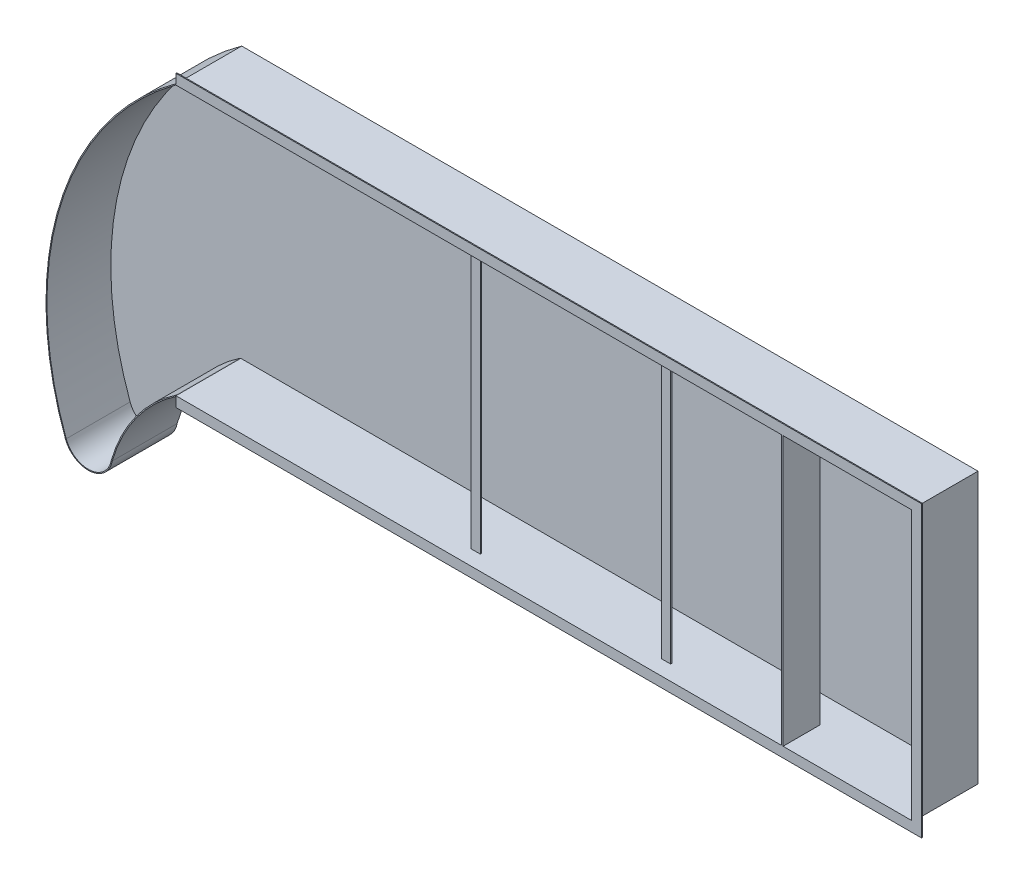
ISO-10303-21;
HEADER;
FILE_DESCRIPTION(('STEP AP214'),'2;1');
FILE_NAME('part.step','',(''),(''),'','','');
FILE_SCHEMA(('AUTOMOTIVE_DESIGN { 1 0 10303 214 1 1 1 1 }'));
ENDSEC;
DATA;
#1=APPLICATION_CONTEXT('core data for automotive mechanical design processes');
#2=APPLICATION_PROTOCOL_DEFINITION('international standard','automotive_design',2000,#1);
#3=PRODUCT_CONTEXT('',#1,'mechanical');
#4=PRODUCT('Part','Part','',(#3));
#5=PRODUCT_RELATED_PRODUCT_CATEGORY('part','',(#4));
#6=PRODUCT_DEFINITION_FORMATION('','',#4);
#7=PRODUCT_DEFINITION_CONTEXT('part definition',#1,'design');
#8=PRODUCT_DEFINITION('design','',#6,#7);
#9=PRODUCT_DEFINITION_SHAPE('','',#8);
#10=(LENGTH_UNIT() NAMED_UNIT(*) SI_UNIT(.MILLI.,.METRE.));
#11=(NAMED_UNIT(*) PLANE_ANGLE_UNIT() SI_UNIT($,.RADIAN.));
#12=(NAMED_UNIT(*) SI_UNIT($,.STERADIAN.) SOLID_ANGLE_UNIT());
#13=UNCERTAINTY_MEASURE_WITH_UNIT(LENGTH_MEASURE(1.E-05),#10,'distance_accuracy_value','');
#14=(GEOMETRIC_REPRESENTATION_CONTEXT(3) GLOBAL_UNCERTAINTY_ASSIGNED_CONTEXT((#13)) GLOBAL_UNIT_ASSIGNED_CONTEXT((#10,
#11,#12)) REPRESENTATION_CONTEXT('',''));
#15=CARTESIAN_POINT('',(0.,0.,0.));
#16=DIRECTION('',(0.,0.,1.));
#17=DIRECTION('',(1.,0.,0.));
#18=AXIS2_PLACEMENT_3D('',#15,#16,#17);
#19=CARTESIAN_POINT('',(793.,290.5,142.));
#20=DIRECTION('',(0.,1.,0.));
#21=DIRECTION('',(0.,0.,1.));
#22=AXIS2_PLACEMENT_3D('',#19,#20,#21);
#23=PLANE('',#22);
#24=DIRECTION('',(0.,0.,1.));
#25=VECTOR('',#24,1.);
#26=CARTESIAN_POINT('',(-170.065727279285,290.5,109.571414121646));
#27=LINE('',#26,#25);
#28=CARTESIAN_POINT('',(-170.065727279285,290.5,106.571414121646));
#29=VERTEX_POINT('',#28);
#30=CARTESIAN_POINT('',(-170.065727279285,290.5,109.571414121646));
#31=VERTEX_POINT('',#30);
#32=EDGE_CURVE('E314',#29,#31,#27,.T.);
#33=ORIENTED_EDGE('',*,*,#32,.F.);
#34=DIRECTION('',(1.,0.,0.));
#35=VECTOR('',#34,1.);
#36=CARTESIAN_POINT('',(-190.065727279285,290.5,106.571414121646));
#37=LINE('',#36,#35);
#38=CARTESIAN_POINT('',(-190.065727279285,290.5,106.571414121646));
#39=VERTEX_POINT('',#38);
#40=EDGE_CURVE('E301',#39,#29,#37,.T.);
#41=ORIENTED_EDGE('',*,*,#40,.F.);
#42=DIRECTION('',(0.,0.,-1.));
#43=VECTOR('',#42,1.);
#44=CARTESIAN_POINT('',(-190.065727279285,290.5,109.571414121646));
#45=LINE('',#44,#43);
#46=CARTESIAN_POINT('',(-190.065727279285,290.5,109.571414121646));
#47=VERTEX_POINT('',#46);
#48=EDGE_CURVE('E306',#47,#39,#45,.T.);
#49=ORIENTED_EDGE('',*,*,#48,.F.);
#50=DIRECTION('',(-1.,0.,0.));
#51=VECTOR('',#50,1.);
#52=CARTESIAN_POINT('',(-190.065727279285,290.5,109.571414121646));
#53=LINE('',#52,#51);
#54=EDGE_CURVE('E310',#31,#47,#53,.T.);
#55=ORIENTED_EDGE('',*,*,#54,.F.);
#56=EDGE_LOOP('',(#33,#41,#49,#55));
#57=FACE_BOUND('',#56,.T.);
#58=DIRECTION('',(1.,0.,0.));
#59=VECTOR('',#58,1.);
#60=CARTESIAN_POINT('',(793.,290.5,142.));
#61=LINE('',#60,#59);
#62=CARTESIAN_POINT('',(516.,290.5,142.));
#63=VERTEX_POINT('',#62);
#64=CARTESIAN_POINT('',(793.,290.5,142.));
#65=VERTEX_POINT('',#64);
#66=EDGE_CURVE('E442',#63,#65,#61,.T.);
#67=ORIENTED_EDGE('',*,*,#66,.F.);
#68=DIRECTION('',(0.,0.,-1.));
#69=VECTOR('',#68,1.);
#70=CARTESIAN_POINT('',(516.,290.5,142.));
#71=LINE('',#70,#69);
#72=CARTESIAN_POINT('',(516.,290.5,62.0000000000001));
#73=VERTEX_POINT('',#72);
#74=EDGE_CURVE('E61',#63,#73,#71,.T.);
#75=ORIENTED_EDGE('',*,*,#74,.T.);
#76=DIRECTION('',(-1.,0.,0.));
#77=VECTOR('',#76,1.);
#78=CARTESIAN_POINT('',(516.,290.5,62.0000000000001));
#79=LINE('',#78,#77);
#80=CARTESIAN_POINT('',(513.,290.5,62.0000000000001));
#81=VERTEX_POINT('',#80);
#82=EDGE_CURVE('E246',#73,#81,#79,.T.);
#83=ORIENTED_EDGE('',*,*,#82,.T.);
#84=DIRECTION('',(0.,0.,-1.));
#85=VECTOR('',#84,1.);
#86=CARTESIAN_POINT('',(513.,290.5,142.));
#87=LINE('',#86,#85);
#88=CARTESIAN_POINT('',(513.,290.5,142.));
#89=VERTEX_POINT('',#88);
#90=EDGE_CURVE('E265',#89,#81,#87,.T.);
#91=ORIENTED_EDGE('',*,*,#90,.F.);
#92=CARTESIAN_POINT('',(-795.,290.5,142.));
#93=VERTEX_POINT('',#92);
#94=EDGE_CURVE('E444',#93,#89,#61,.T.);
#95=ORIENTED_EDGE('',*,*,#94,.F.);
#96=DIRECTION('',(0.,0.,-1.));
#97=VECTOR('',#96,1.);
#98=CARTESIAN_POINT('',(-795.,290.5,142.));
#99=LINE('',#98,#97);
#100=CARTESIAN_POINT('',(-795.,290.5,140.));
#101=VERTEX_POINT('',#100);
#102=EDGE_CURVE('E470',#93,#101,#99,.T.);
#103=ORIENTED_EDGE('',*,*,#102,.T.);
#104=DIRECTION('',(0.,0.,-1.));
#105=VECTOR('',#104,1.);
#106=CARTESIAN_POINT('',(-795.,290.5,142.));
#107=LINE('',#106,#105);
#108=CARTESIAN_POINT('',(-795.,290.5,2.));
#109=VERTEX_POINT('',#108);
#110=EDGE_CURVE('E398',#101,#109,#107,.T.);
#111=ORIENTED_EDGE('',*,*,#110,.T.);
#112=DIRECTION('',(1.,0.,0.));
#113=VECTOR('',#112,1.);
#114=CARTESIAN_POINT('',(793.,290.5,2.));
#115=LINE('',#114,#113);
#116=CARTESIAN_POINT('',(793.,290.5,2.));
#117=VERTEX_POINT('',#116);
#118=EDGE_CURVE('E439',#109,#117,#115,.T.);
#119=ORIENTED_EDGE('',*,*,#118,.T.);
#120=DIRECTION('',(0.,0.,-1.));
#121=VECTOR('',#120,1.);
#122=CARTESIAN_POINT('',(793.,290.5,142.));
#123=LINE('',#122,#121);
#124=EDGE_CURVE('E467',#65,#117,#123,.T.);
#125=ORIENTED_EDGE('',*,*,#124,.F.);
#126=EDGE_LOOP('',(#67,#75,#83,#91,#95,#103,#111,#119,#125));
#127=FACE_BOUND('',#126,.T.);
#128=DIRECTION('',(0.,0.,1.));
#129=VECTOR('',#128,1.);
#130=CARTESIAN_POINT('',(240.676945023838,290.5,109.571414121646));
#131=LINE('',#130,#129);
#132=CARTESIAN_POINT('',(240.676945023838,290.5,106.571414121646));
#133=VERTEX_POINT('',#132);
#134=CARTESIAN_POINT('',(240.676945023838,290.5,109.571414121646));
#135=VERTEX_POINT('',#134);
#136=EDGE_CURVE('E282',#133,#135,#131,.T.);
#137=ORIENTED_EDGE('',*,*,#136,.F.);
#138=DIRECTION('',(1.,0.,0.));
#139=VECTOR('',#138,1.);
#140=CARTESIAN_POINT('',(220.676945023838,290.5,106.571414121646));
#141=LINE('',#140,#139);
#142=CARTESIAN_POINT('',(220.676945023838,290.5,106.571414121646));
#143=VERTEX_POINT('',#142);
#144=EDGE_CURVE('E269',#143,#133,#141,.T.);
#145=ORIENTED_EDGE('',*,*,#144,.F.);
#146=DIRECTION('',(0.,0.,-1.));
#147=VECTOR('',#146,1.);
#148=CARTESIAN_POINT('',(220.676945023838,290.5,109.571414121646));
#149=LINE('',#148,#147);
#150=CARTESIAN_POINT('',(220.676945023838,290.5,109.571414121646));
#151=VERTEX_POINT('',#150);
#152=EDGE_CURVE('E274',#151,#143,#149,.T.);
#153=ORIENTED_EDGE('',*,*,#152,.F.);
#154=DIRECTION('',(-1.,0.,0.));
#155=VECTOR('',#154,1.);
#156=CARTESIAN_POINT('',(220.676945023838,290.5,109.571414121646));
#157=LINE('',#156,#155);
#158=EDGE_CURVE('E278',#135,#151,#157,.T.);
#159=ORIENTED_EDGE('',*,*,#158,.F.);
#160=EDGE_LOOP('',(#137,#145,#153,#159));
#161=FACE_BOUND('',#160,.T.);
#162=ADVANCED_FACE('F37',(#57,#127,#161),#23,.F.);
#163=CARTESIAN_POINT('',(-795.,-290.5,142.));
#164=DIRECTION('',(0.,-1.,0.));
#165=DIRECTION('',(0.,0.,-1.));
#166=AXIS2_PLACEMENT_3D('',#163,#164,#165);
#167=PLANE('',#166);
#168=DIRECTION('',(0.,0.,1.));
#169=VECTOR('',#168,1.);
#170=CARTESIAN_POINT('',(-170.065727279285,-290.5,109.571414121646));
#171=LINE('',#170,#169);
#172=CARTESIAN_POINT('',(-170.065727279285,-290.5,106.571414121646));
#173=VERTEX_POINT('',#172);
#174=CARTESIAN_POINT('',(-170.065727279285,-290.5,109.571414121646));
#175=VERTEX_POINT('',#174);
#176=EDGE_CURVE('E322',#173,#175,#171,.T.);
#177=ORIENTED_EDGE('',*,*,#176,.T.);
#178=DIRECTION('',(-1.,0.,0.));
#179=VECTOR('',#178,1.);
#180=CARTESIAN_POINT('',(-190.065727279285,-290.5,109.571414121646));
#181=LINE('',#180,#179);
#182=CARTESIAN_POINT('',(-190.065727279285,-290.5,109.571414121646));
#183=VERTEX_POINT('',#182);
#184=EDGE_CURVE('E320',#175,#183,#181,.T.);
#185=ORIENTED_EDGE('',*,*,#184,.T.);
#186=DIRECTION('',(0.,0.,-1.));
#187=VECTOR('',#186,1.);
#188=CARTESIAN_POINT('',(-190.065727279285,-290.5,109.571414121646));
#189=LINE('',#188,#187);
#190=CARTESIAN_POINT('',(-190.065727279285,-290.5,106.571414121646));
#191=VERTEX_POINT('',#190);
#192=EDGE_CURVE('E317',#183,#191,#189,.T.);
#193=ORIENTED_EDGE('',*,*,#192,.T.);
#194=DIRECTION('',(1.,0.,0.));
#195=VECTOR('',#194,1.);
#196=CARTESIAN_POINT('',(-190.065727279285,-290.5,106.571414121646));
#197=LINE('',#196,#195);
#198=EDGE_CURVE('E304',#191,#173,#197,.T.);
#199=ORIENTED_EDGE('',*,*,#198,.T.);
#200=EDGE_LOOP('',(#177,#185,#193,#199));
#201=FACE_BOUND('',#200,.T.);
#202=DIRECTION('',(-1.,0.,0.));
#203=VECTOR('',#202,1.);
#204=CARTESIAN_POINT('',(516.,-290.5,62.0000000000001));
#205=LINE('',#204,#203);
#206=CARTESIAN_POINT('',(516.,-290.5,62.0000000000001));
#207=VERTEX_POINT('',#206);
#208=CARTESIAN_POINT('',(513.,-290.5,62.0000000000001));
#209=VERTEX_POINT('',#208);
#210=EDGE_CURVE('E244',#207,#209,#205,.T.);
#211=ORIENTED_EDGE('',*,*,#210,.F.);
#212=DIRECTION('',(0.,0.,-1.));
#213=VECTOR('',#212,1.);
#214=CARTESIAN_POINT('',(516.,-290.5,142.));
#215=LINE('',#214,#213);
#216=CARTESIAN_POINT('',(516.,-290.5,142.));
#217=VERTEX_POINT('',#216);
#218=EDGE_CURVE('E247',#217,#207,#215,.T.);
#219=ORIENTED_EDGE('',*,*,#218,.F.);
#220=DIRECTION('',(-1.,0.,0.));
#221=VECTOR('',#220,1.);
#222=CARTESIAN_POINT('',(-795.,-290.5,142.));
#223=LINE('',#222,#221);
#224=CARTESIAN_POINT('',(793.,-290.5,142.));
#225=VERTEX_POINT('',#224);
#226=EDGE_CURVE('E450',#225,#217,#223,.T.);
#227=ORIENTED_EDGE('',*,*,#226,.F.);
#228=DIRECTION('',(0.,0.,-1.));
#229=VECTOR('',#228,1.);
#230=CARTESIAN_POINT('',(793.,-290.5,142.));
#231=LINE('',#230,#229);
#232=CARTESIAN_POINT('',(793.,-290.5,2.));
#233=VERTEX_POINT('',#232);
#234=EDGE_CURVE('E464',#225,#233,#231,.T.);
#235=ORIENTED_EDGE('',*,*,#234,.T.);
#236=DIRECTION('',(-1.,0.,0.));
#237=VECTOR('',#236,1.);
#238=CARTESIAN_POINT('',(-795.,-290.5,2.));
#239=LINE('',#238,#237);
#240=CARTESIAN_POINT('',(-795.,-290.5,2.));
#241=VERTEX_POINT('',#240);
#242=EDGE_CURVE('E443',#233,#241,#239,.T.);
#243=ORIENTED_EDGE('',*,*,#242,.T.);
#244=DIRECTION('',(0.,0.,1.));
#245=VECTOR('',#244,1.);
#246=CARTESIAN_POINT('',(-795.,-290.5,142.));
#247=LINE('',#246,#245);
#248=CARTESIAN_POINT('',(-795.,-290.5,140.));
#249=VERTEX_POINT('',#248);
#250=EDGE_CURVE('E394',#241,#249,#247,.T.);
#251=ORIENTED_EDGE('',*,*,#250,.T.);
#252=DIRECTION('',(0.,0.,-1.));
#253=VECTOR('',#252,1.);
#254=CARTESIAN_POINT('',(-795.,-290.5,142.));
#255=LINE('',#254,#253);
#256=CARTESIAN_POINT('',(-795.,-290.5,142.));
#257=VERTEX_POINT('',#256);
#258=EDGE_CURVE('E454',#257,#249,#255,.T.);
#259=ORIENTED_EDGE('',*,*,#258,.F.);
#260=CARTESIAN_POINT('',(513.,-290.5,142.));
#261=VERTEX_POINT('',#260);
#262=EDGE_CURVE('E449',#261,#257,#223,.T.);
#263=ORIENTED_EDGE('',*,*,#262,.F.);
#264=DIRECTION('',(0.,0.,-1.));
#265=VECTOR('',#264,1.);
#266=CARTESIAN_POINT('',(513.,-290.5,142.));
#267=LINE('',#266,#265);
#268=EDGE_CURVE('E53',#261,#209,#267,.T.);
#269=ORIENTED_EDGE('',*,*,#268,.T.);
#270=EDGE_LOOP('',(#211,#219,#227,#235,#243,#251,#259,#263,#269));
#271=FACE_BOUND('',#270,.T.);
#272=DIRECTION('',(0.,0.,1.));
#273=VECTOR('',#272,1.);
#274=CARTESIAN_POINT('',(240.676945023838,-290.5,109.571414121646));
#275=LINE('',#274,#273);
#276=CARTESIAN_POINT('',(240.676945023838,-290.5,106.571414121646));
#277=VERTEX_POINT('',#276);
#278=CARTESIAN_POINT('',(240.676945023838,-290.5,109.571414121646));
#279=VERTEX_POINT('',#278);
#280=EDGE_CURVE('E290',#277,#279,#275,.T.);
#281=ORIENTED_EDGE('',*,*,#280,.T.);
#282=DIRECTION('',(-1.,0.,0.));
#283=VECTOR('',#282,1.);
#284=CARTESIAN_POINT('',(220.676945023838,-290.5,109.571414121646));
#285=LINE('',#284,#283);
#286=CARTESIAN_POINT('',(220.676945023838,-290.5,109.571414121646));
#287=VERTEX_POINT('',#286);
#288=EDGE_CURVE('E288',#279,#287,#285,.T.);
#289=ORIENTED_EDGE('',*,*,#288,.T.);
#290=DIRECTION('',(0.,0.,-1.));
#291=VECTOR('',#290,1.);
#292=CARTESIAN_POINT('',(220.676945023838,-290.5,109.571414121646));
#293=LINE('',#292,#291);
#294=CARTESIAN_POINT('',(220.676945023838,-290.5,106.571414121646));
#295=VERTEX_POINT('',#294);
#296=EDGE_CURVE('E285',#287,#295,#293,.T.);
#297=ORIENTED_EDGE('',*,*,#296,.T.);
#298=DIRECTION('',(1.,0.,0.));
#299=VECTOR('',#298,1.);
#300=CARTESIAN_POINT('',(220.676945023838,-290.5,106.571414121646));
#301=LINE('',#300,#299);
#302=EDGE_CURVE('E272',#295,#277,#301,.T.);
#303=ORIENTED_EDGE('',*,*,#302,.T.);
#304=EDGE_LOOP('',(#281,#289,#297,#303));
#305=FACE_BOUND('',#304,.T.);
#306=ADVANCED_FACE('F256',(#201,#271,#305),#167,.F.);
#307=CARTESIAN_POINT('',(-795.,-292.5,2.));
#308=DIRECTION('',(1.,0.,0.));
#309=DIRECTION('',(0.,0.,-1.));
#310=AXIS2_PLACEMENT_3D('',#307,#308,#309);
#311=PLANE('',#310);
#312=DIRECTION('',(0.,-1.,0.));
#313=VECTOR('',#312,1.);
#314=CARTESIAN_POINT('',(-795.,292.5,140.));
#315=LINE('',#314,#313);
#316=CARTESIAN_POINT('',(-795.,-292.5,140.));
#317=VERTEX_POINT('',#316);
#318=EDGE_CURVE('E377',#249,#317,#315,.T.);
#319=ORIENTED_EDGE('',*,*,#318,.T.);
#320=DIRECTION('',(0.,1.,0.));
#321=VECTOR('',#320,1.);
#322=CARTESIAN_POINT('',(-795.,-312.5,140.));
#323=LINE('',#322,#321);
#324=CARTESIAN_POINT('',(-795.,-312.5,140.));
#325=VERTEX_POINT('',#324);
#326=EDGE_CURVE('E434',#325,#317,#323,.T.);
#327=ORIENTED_EDGE('',*,*,#326,.F.);
#328=DIRECTION('',(0.,0.,-1.));
#329=VECTOR('',#328,1.);
#330=CARTESIAN_POINT('',(-795.,-312.5,142.));
#331=LINE('',#330,#329);
#332=CARTESIAN_POINT('',(-795.,-312.5,142.));
#333=VERTEX_POINT('',#332);
#334=EDGE_CURVE('E430',#333,#325,#331,.T.);
#335=ORIENTED_EDGE('',*,*,#334,.F.);
#336=DIRECTION('',(0.,-1.,0.));
#337=VECTOR('',#336,1.);
#338=CARTESIAN_POINT('',(-795.,-290.5,142.));
#339=LINE('',#338,#337);
#340=EDGE_CURVE('E452',#257,#333,#339,.T.);
#341=ORIENTED_EDGE('',*,*,#340,.F.);
#342=ORIENTED_EDGE('',*,*,#258,.T.);
#343=EDGE_LOOP('',(#319,#327,#335,#341,#342));
#344=FACE_BOUND('',#343,.T.);
#345=ADVANCED_FACE('F532',(#344),#311,.F.);
#346=CARTESIAN_POINT('',(-795.,292.5,140.));
#347=VERTEX_POINT('',#346);
#348=EDGE_CURVE('E378',#347,#101,#315,.T.);
#349=ORIENTED_EDGE('',*,*,#348,.T.);
#350=ORIENTED_EDGE('',*,*,#102,.F.);
#351=DIRECTION('',(0.,-1.,0.));
#352=VECTOR('',#351,1.);
#353=CARTESIAN_POINT('',(-795.,292.5,142.));
#354=LINE('',#353,#352);
#355=CARTESIAN_POINT('',(-795.,312.5,142.));
#356=VERTEX_POINT('',#355);
#357=EDGE_CURVE('E440',#356,#93,#354,.T.);
#358=ORIENTED_EDGE('',*,*,#357,.F.);
#359=DIRECTION('',(0.,0.,-1.));
#360=VECTOR('',#359,1.);
#361=CARTESIAN_POINT('',(-795.,312.5,142.));
#362=LINE('',#361,#360);
#363=CARTESIAN_POINT('',(-795.,312.5,140.));
#364=VERTEX_POINT('',#363);
#365=EDGE_CURVE('E419',#356,#364,#362,.T.);
#366=ORIENTED_EDGE('',*,*,#365,.T.);
#367=DIRECTION('',(0.,-1.,0.));
#368=VECTOR('',#367,1.);
#369=CARTESIAN_POINT('',(-795.,312.5,140.));
#370=LINE('',#369,#368);
#371=EDGE_CURVE('E422',#364,#347,#370,.T.);
#372=ORIENTED_EDGE('',*,*,#371,.T.);
#373=EDGE_LOOP('',(#349,#350,#358,#366,#372));
#374=FACE_BOUND('',#373,.T.);
#375=ADVANCED_FACE('F548',(#374),#311,.F.);
#376=CARTESIAN_POINT('',(795.,-292.5,2.));
#377=DIRECTION('',(-1.,0.,0.));
#378=DIRECTION('',(0.,0.,1.));
#379=AXIS2_PLACEMENT_3D('',#376,#377,#378);
#380=PLANE('',#379);
#381=DIRECTION('',(0.,1.,0.));
#382=VECTOR('',#381,1.);
#383=CARTESIAN_POINT('',(795.,292.5,140.));
#384=LINE('',#383,#382);
#385=CARTESIAN_POINT('',(795.,-292.5,140.));
#386=VERTEX_POINT('',#385);
#387=CARTESIAN_POINT('',(795.,292.5,140.));
#388=VERTEX_POINT('',#387);
#389=EDGE_CURVE('E11',#386,#388,#384,.T.);
#390=ORIENTED_EDGE('',*,*,#389,.F.);
#391=DIRECTION('',(0.,0.,-1.));
#392=VECTOR('',#391,1.);
#393=CARTESIAN_POINT('',(795.,-292.5,2.));
#394=LINE('',#393,#392);
#395=CARTESIAN_POINT('',(795.,-292.5,0.));
#396=VERTEX_POINT('',#395);
#397=EDGE_CURVE('E481',#386,#396,#394,.T.);
#398=ORIENTED_EDGE('',*,*,#397,.T.);
#399=DIRECTION('',(0.,1.,0.));
#400=VECTOR('',#399,1.);
#401=CARTESIAN_POINT('',(795.,-292.5,0.));
#402=LINE('',#401,#400);
#403=CARTESIAN_POINT('',(795.,292.5,0.));
#404=VERTEX_POINT('',#403);
#405=EDGE_CURVE('E473',#396,#404,#402,.T.);
#406=ORIENTED_EDGE('',*,*,#405,.T.);
#407=DIRECTION('',(0.,0.,-1.));
#408=VECTOR('',#407,1.);
#409=CARTESIAN_POINT('',(795.,292.5,2.));
#410=LINE('',#409,#408);
#411=EDGE_CURVE('E41',#388,#404,#410,.T.);
#412=ORIENTED_EDGE('',*,*,#411,.F.);
#413=EDGE_LOOP('',(#390,#398,#406,#412));
#414=FACE_BOUND('',#413,.T.);
#415=ADVANCED_FACE('F39',(#414),#380,.F.);
#416=CARTESIAN_POINT('',(-795.,-292.5,2.));
#417=DIRECTION('',(0.,1.,0.));
#418=DIRECTION('',(0.,0.,1.));
#419=AXIS2_PLACEMENT_3D('',#416,#417,#418);
#420=PLANE('',#419);
#421=DIRECTION('',(1.,0.,0.));
#422=VECTOR('',#421,1.);
#423=CARTESIAN_POINT('',(-795.,-292.5,140.));
#424=LINE('',#423,#422);
#425=EDGE_CURVE('E426',#317,#386,#424,.T.);
#426=ORIENTED_EDGE('',*,*,#425,.F.);
#427=DIRECTION('',(0.,0.,-1.));
#428=VECTOR('',#427,1.);
#429=CARTESIAN_POINT('',(-795.,-292.5,2.));
#430=LINE('',#429,#428);
#431=CARTESIAN_POINT('',(-795.,-292.5,0.));
#432=VERTEX_POINT('',#431);
#433=EDGE_CURVE('E483',#317,#432,#430,.T.);
#434=ORIENTED_EDGE('',*,*,#433,.T.);
#435=DIRECTION('',(1.,0.,0.));
#436=VECTOR('',#435,1.);
#437=CARTESIAN_POINT('',(-795.,-292.5,0.));
#438=LINE('',#437,#436);
#439=EDGE_CURVE('E478',#432,#396,#438,.T.);
#440=ORIENTED_EDGE('',*,*,#439,.T.);
#441=ORIENTED_EDGE('',*,*,#397,.F.);
#442=EDGE_LOOP('',(#426,#434,#440,#441));
#443=FACE_BOUND('',#442,.T.);
#444=ADVANCED_FACE('F502',(#443),#420,.F.);
#445=CARTESIAN_POINT('',(0.,0.,2.));
#446=DIRECTION('',(0.,0.,-1.));
#447=DIRECTION('',(-1.,0.,0.));
#448=AXIS2_PLACEMENT_3D('',#445,#446,#447);
#449=PLANE('',#448);
#450=ORIENTED_EDGE('',*,*,#242,.F.);
#451=DIRECTION('',(0.,-1.,0.));
#452=VECTOR('',#451,1.);
#453=CARTESIAN_POINT('',(793.,-290.5,2.));
#454=LINE('',#453,#452);
#455=EDGE_CURVE('E457',#117,#233,#454,.T.);
#456=ORIENTED_EDGE('',*,*,#455,.F.);
#457=ORIENTED_EDGE('',*,*,#118,.F.);
#458=DIRECTION('',(-0.723379264964384,-0.69045089544412,0.));
#459=VECTOR('',#458,1.);
#460=CARTESIAN_POINT('',(-524.086847710899,549.081131150903,2.));
#461=LINE('',#460,#459);
#462=CARTESIAN_POINT('',(-797.,288.591040401944,2.));
#463=VERTEX_POINT('',#462);
#464=EDGE_CURVE('E338',#109,#463,#461,.T.);
#465=ORIENTED_EDGE('',*,*,#464,.T.);
#466=CARTESIAN_POINT('',(-400.354894352362,-257.884436586143,2.));
#467=DIRECTION('',(0.,0.,1.));
#468=DIRECTION('',(1.,0.,0.));
#469=AXIS2_PLACEMENT_3D('',#466,#467,#468);
#470=CIRCLE('',#469,675.250166074458);
#471=CARTESIAN_POINT('',(-1033.91490125045,-491.474899668173,2.));
#472=VERTEX_POINT('',#471);
#473=EDGE_CURVE('E341',#463,#472,#470,.T.);
#474=ORIENTED_EDGE('',*,*,#473,.T.);
#475=CARTESIAN_POINT('',(-986.369111639837,-473.945000539723,2.));
#476=DIRECTION('',(0.,0.,1.));
#477=DIRECTION('',(1.,0.,0.));
#478=AXIS2_PLACEMENT_3D('',#475,#476,#477);
#479=CIRCLE('',#478,50.6744459580012);
#480=CARTESIAN_POINT('',(-936.512623715159,-483.013081095541,2.));
#481=VERTEX_POINT('',#480);
#482=EDGE_CURVE('E344',#472,#481,#479,.T.);
#483=ORIENTED_EDGE('',*,*,#482,.T.);
#484=CARTESIAN_POINT('',(-604.843589110414,-577.950649610838,2.));
#485=DIRECTION('',(0.,0.,1.));
#486=DIRECTION('',(1.,0.,0.));
#487=AXIS2_PLACEMENT_3D('',#484,#485,#486);
#488=CIRCLE('',#487,344.989116395343);
#489=CARTESIAN_POINT('',(-797.,-291.431183980189,2.));
#490=VERTEX_POINT('',#489);
#491=EDGE_CURVE('E333',#490,#481,#488,.T.);
#492=ORIENTED_EDGE('',*,*,#491,.F.);
#493=DIRECTION('',(-0.906556132597208,-0.422085273908477,0.));
#494=VECTOR('',#493,1.);
#495=CARTESIAN_POINT('',(-30.4759227444896,65.4562866046979,2.));
#496=LINE('',#495,#494);
#497=EDGE_CURVE('E335',#241,#490,#496,.T.);
#498=ORIENTED_EDGE('',*,*,#497,.F.);
#499=EDGE_LOOP('',(#450,#456,#457,#465,#474,#483,#492,#498));
#500=FACE_BOUND('',#499,.T.);
#501=ADVANCED_FACE('F539',(#500),#449,.F.);
#502=CARTESIAN_POINT('',(-795.,292.5,2.));
#503=DIRECTION('',(0.,-1.,0.));
#504=DIRECTION('',(0.,0.,-1.));
#505=AXIS2_PLACEMENT_3D('',#502,#503,#504);
#506=PLANE('',#505);
#507=DIRECTION('',(0.,0.,-1.));
#508=VECTOR('',#507,1.);
#509=CARTESIAN_POINT('',(-795.,292.5,2.));
#510=LINE('',#509,#508);
#511=CARTESIAN_POINT('',(-795.,292.5,0.));
#512=VERTEX_POINT('',#511);
#513=EDGE_CURVE('E484',#347,#512,#510,.T.);
#514=ORIENTED_EDGE('',*,*,#513,.F.);
#515=DIRECTION('',(1.,0.,0.));
#516=VECTOR('',#515,1.);
#517=CARTESIAN_POINT('',(-795.,292.5,140.));
#518=LINE('',#517,#516);
#519=EDGE_CURVE('E412',#347,#388,#518,.T.);
#520=ORIENTED_EDGE('',*,*,#519,.T.);
#521=ORIENTED_EDGE('',*,*,#411,.T.);
#522=DIRECTION('',(-1.,0.,0.));
#523=VECTOR('',#522,1.);
#524=CARTESIAN_POINT('',(-795.,292.5,0.));
#525=LINE('',#524,#523);
#526=EDGE_CURVE('E476',#404,#512,#525,.T.);
#527=ORIENTED_EDGE('',*,*,#526,.T.);
#528=EDGE_LOOP('',(#514,#520,#521,#527));
#529=FACE_BOUND('',#528,.T.);
#530=ADVANCED_FACE('F492',(#529),#506,.F.);
#531=CARTESIAN_POINT('',(0.,0.,0.));
#532=DIRECTION('',(0.,0.,-1.));
#533=DIRECTION('',(-1.,0.,0.));
#534=AXIS2_PLACEMENT_3D('',#531,#532,#533);
#535=PLANE('',#534);
#536=ORIENTED_EDGE('',*,*,#405,.F.);
#537=ORIENTED_EDGE('',*,*,#439,.F.);
#538=CARTESIAN_POINT('',(-604.843589110414,-577.950649610838,0.));
#539=DIRECTION('',(0.,0.,-1.));
#540=DIRECTION('',(-1.,0.,0.));
#541=AXIS2_PLACEMENT_3D('',#538,#539,#540);
#542=CIRCLE('',#541,342.989116395343);
#543=CARTESIAN_POINT('',(-934.562903860346,-483.469395139416,0.));
#544=VERTEX_POINT('',#543);
#545=EDGE_CURVE('E374',#544,#432,#542,.T.);
#546=ORIENTED_EDGE('',*,*,#545,.F.);
#547=CARTESIAN_POINT('',(-986.369111639837,-473.945000539723,0.));
#548=DIRECTION('',(0.,0.,-1.));
#549=DIRECTION('',(-1.,0.,0.));
#550=AXIS2_PLACEMENT_3D('',#547,#548,#549);
#551=CIRCLE('',#550,52.6744459580011);
#552=CARTESIAN_POINT('',(-1035.79142061684,-492.166763142832,0.));
#553=VERTEX_POINT('',#552);
#554=EDGE_CURVE('E363',#544,#553,#551,.T.);
#555=ORIENTED_EDGE('',*,*,#554,.T.);
#556=CARTESIAN_POINT('',(-400.354894352362,-257.884436586143,0.));
#557=DIRECTION('',(0.,0.,-1.));
#558=DIRECTION('',(-1.,0.,0.));
#559=AXIS2_PLACEMENT_3D('',#556,#557,#558);
#560=CIRCLE('',#559,677.250166074458);
#561=EDGE_CURVE('E387',#553,#512,#560,.T.);
#562=ORIENTED_EDGE('',*,*,#561,.T.);
#563=ORIENTED_EDGE('',*,*,#526,.F.);
#564=EDGE_LOOP('',(#536,#537,#546,#555,#562,#563));
#565=FACE_BOUND('',#564,.T.);
#566=ADVANCED_FACE('F497',(#565),#535,.T.);
#567=CARTESIAN_POINT('',(793.,-290.5,142.));
#568=DIRECTION('',(1.,0.,0.));
#569=DIRECTION('',(0.,0.,-1.));
#570=AXIS2_PLACEMENT_3D('',#567,#568,#569);
#571=PLANE('',#570);
#572=ORIENTED_EDGE('',*,*,#455,.T.);
#573=ORIENTED_EDGE('',*,*,#234,.F.);
#574=DIRECTION('',(0.,-1.,0.));
#575=VECTOR('',#574,1.);
#576=CARTESIAN_POINT('',(793.,-290.5,142.));
#577=LINE('',#576,#575);
#578=EDGE_CURVE('E447',#65,#225,#577,.T.);
#579=ORIENTED_EDGE('',*,*,#578,.F.);
#580=ORIENTED_EDGE('',*,*,#124,.T.);
#581=EDGE_LOOP('',(#572,#573,#579,#580));
#582=FACE_BOUND('',#581,.T.);
#583=ADVANCED_FACE('F538',(#582),#571,.F.);
#584=CARTESIAN_POINT('',(0.,0.,142.));
#585=DIRECTION('',(0.,0.,1.));
#586=DIRECTION('',(1.,0.,0.));
#587=AXIS2_PLACEMENT_3D('',#584,#585,#586);
#588=PLANE('',#587);
#589=ORIENTED_EDGE('',*,*,#226,.T.);
#590=DIRECTION('',(0.,1.,0.));
#591=VECTOR('',#590,1.);
#592=CARTESIAN_POINT('',(516.,-370.556230238502,142.));
#593=LINE('',#592,#591);
#594=EDGE_CURVE('E251',#217,#63,#593,.T.);
#595=ORIENTED_EDGE('',*,*,#594,.T.);
#596=ORIENTED_EDGE('',*,*,#66,.T.);
#597=ORIENTED_EDGE('',*,*,#578,.T.);
#598=EDGE_LOOP('',(#589,#595,#596,#597));
#599=FACE_BOUND('',#598,.T.);
#600=ORIENTED_EDGE('',*,*,#340,.T.);
#601=DIRECTION('',(-1.,0.,0.));
#602=VECTOR('',#601,1.);
#603=CARTESIAN_POINT('',(-795.,-312.5,142.));
#604=LINE('',#603,#602);
#605=CARTESIAN_POINT('',(815.,-312.5,142.));
#606=VERTEX_POINT('',#605);
#607=EDGE_CURVE('E427',#606,#333,#604,.T.);
#608=ORIENTED_EDGE('',*,*,#607,.F.);
#609=DIRECTION('',(0.,-1.,0.));
#610=VECTOR('',#609,1.);
#611=CARTESIAN_POINT('',(815.,312.5,142.));
#612=LINE('',#611,#610);
#613=CARTESIAN_POINT('',(815.,312.5,142.));
#614=VERTEX_POINT('',#613);
#615=EDGE_CURVE('E407',#614,#606,#612,.T.);
#616=ORIENTED_EDGE('',*,*,#615,.F.);
#617=DIRECTION('',(-1.,0.,0.));
#618=VECTOR('',#617,1.);
#619=CARTESIAN_POINT('',(-795.,312.5,142.));
#620=LINE('',#619,#618);
#621=EDGE_CURVE('E414',#614,#356,#620,.T.);
#622=ORIENTED_EDGE('',*,*,#621,.T.);
#623=ORIENTED_EDGE('',*,*,#357,.T.);
#624=ORIENTED_EDGE('',*,*,#94,.T.);
#625=DIRECTION('',(0.,1.,0.));
#626=VECTOR('',#625,1.);
#627=CARTESIAN_POINT('',(513.,-370.556230238502,142.));
#628=LINE('',#627,#626);
#629=EDGE_CURVE('E261',#261,#89,#628,.T.);
#630=ORIENTED_EDGE('',*,*,#629,.F.);
#631=ORIENTED_EDGE('',*,*,#262,.T.);
#632=EDGE_LOOP('',(#600,#608,#616,#622,#623,#624,#630,#631));
#633=FACE_BOUND('',#632,.T.);
#634=ADVANCED_FACE('F567',(#599,#633),#588,.T.);
#635=CARTESIAN_POINT('',(-795.,-312.5,140.));
#636=DIRECTION('',(0.,0.,1.));
#637=DIRECTION('',(1.,0.,0.));
#638=AXIS2_PLACEMENT_3D('',#635,#636,#637);
#639=PLANE('',#638);
#640=ORIENTED_EDGE('',*,*,#425,.T.);
#641=ORIENTED_EDGE('',*,*,#389,.T.);
#642=ORIENTED_EDGE('',*,*,#519,.F.);
#643=ORIENTED_EDGE('',*,*,#371,.F.);
#644=DIRECTION('',(1.,0.,0.));
#645=VECTOR('',#644,1.);
#646=CARTESIAN_POINT('',(-795.,312.5,140.));
#647=LINE('',#646,#645);
#648=CARTESIAN_POINT('',(815.,312.5,140.));
#649=VERTEX_POINT('',#648);
#650=EDGE_CURVE('E417',#364,#649,#647,.T.);
#651=ORIENTED_EDGE('',*,*,#650,.T.);
#652=DIRECTION('',(0.,1.,0.));
#653=VECTOR('',#652,1.);
#654=CARTESIAN_POINT('',(815.,292.5,140.));
#655=LINE('',#654,#653);
#656=CARTESIAN_POINT('',(815.,-312.5,140.));
#657=VERTEX_POINT('',#656);
#658=EDGE_CURVE('E401',#657,#649,#655,.T.);
#659=ORIENTED_EDGE('',*,*,#658,.F.);
#660=DIRECTION('',(1.,0.,0.));
#661=VECTOR('',#660,1.);
#662=CARTESIAN_POINT('',(-795.,-312.5,140.));
#663=LINE('',#662,#661);
#664=EDGE_CURVE('E432',#325,#657,#663,.T.);
#665=ORIENTED_EDGE('',*,*,#664,.F.);
#666=ORIENTED_EDGE('',*,*,#326,.T.);
#667=EDGE_LOOP('',(#640,#641,#642,#643,#651,#659,#665,#666));
#668=FACE_BOUND('',#667,.T.);
#669=ADVANCED_FACE('F575',(#668),#639,.F.);
#670=CARTESIAN_POINT('',(0.,-312.5,0.));
#671=DIRECTION('',(0.,1.,0.));
#672=DIRECTION('',(0.,0.,1.));
#673=AXIS2_PLACEMENT_3D('',#670,#671,#672);
#674=PLANE('',#673);
#675=ORIENTED_EDGE('',*,*,#607,.T.);
#676=ORIENTED_EDGE('',*,*,#334,.T.);
#677=ORIENTED_EDGE('',*,*,#664,.T.);
#678=DIRECTION('',(0.,0.,-1.));
#679=VECTOR('',#678,1.);
#680=CARTESIAN_POINT('',(815.,-312.5,142.));
#681=LINE('',#680,#679);
#682=EDGE_CURVE('E410',#606,#657,#681,.T.);
#683=ORIENTED_EDGE('',*,*,#682,.F.);
#684=EDGE_LOOP('',(#675,#676,#677,#683));
#685=FACE_BOUND('',#684,.T.);
#686=ADVANCED_FACE('F584',(#685),#674,.F.);
#687=CARTESIAN_POINT('',(0.,312.5,0.));
#688=DIRECTION('',(0.,-1.,0.));
#689=DIRECTION('',(0.,0.,1.));
#690=AXIS2_PLACEMENT_3D('',#687,#688,#689);
#691=PLANE('',#690);
#692=ORIENTED_EDGE('',*,*,#621,.F.);
#693=DIRECTION('',(0.,0.,1.));
#694=VECTOR('',#693,1.);
#695=CARTESIAN_POINT('',(815.,312.5,140.));
#696=LINE('',#695,#694);
#697=EDGE_CURVE('E404',#649,#614,#696,.T.);
#698=ORIENTED_EDGE('',*,*,#697,.F.);
#699=ORIENTED_EDGE('',*,*,#650,.F.);
#700=ORIENTED_EDGE('',*,*,#365,.F.);
#701=EDGE_LOOP('',(#692,#698,#699,#700));
#702=FACE_BOUND('',#701,.T.);
#703=ADVANCED_FACE('F593',(#702),#691,.F.);
#704=CARTESIAN_POINT('',(815.,0.,0.));
#705=DIRECTION('',(1.,0.,0.));
#706=DIRECTION('',(0.,0.,-1.));
#707=AXIS2_PLACEMENT_3D('',#704,#705,#706);
#708=PLANE('',#707);
#709=ORIENTED_EDGE('',*,*,#658,.T.);
#710=ORIENTED_EDGE('',*,*,#697,.T.);
#711=ORIENTED_EDGE('',*,*,#615,.T.);
#712=ORIENTED_EDGE('',*,*,#682,.T.);
#713=EDGE_LOOP('',(#709,#710,#711,#712));
#714=FACE_BOUND('',#713,.T.);
#715=ADVANCED_FACE('F601',(#714),#708,.T.);
#716=CARTESIAN_POINT('',(-986.369111639837,-473.945000539723,140.));
#717=DIRECTION('',(0.,0.,-1.));
#718=DIRECTION('',(-1.,0.,0.));
#719=AXIS2_PLACEMENT_3D('',#716,#717,#718);
#720=CYLINDRICAL_SURFACE('',#719,52.6744459580011);
#721=ORIENTED_EDGE('',*,*,#554,.F.);
#722=DIRECTION('',(0.,0.,-1.));
#723=VECTOR('',#722,1.);
#724=CARTESIAN_POINT('',(-934.562903860346,-483.469395139416,140.));
#725=LINE('',#724,#723);
#726=CARTESIAN_POINT('',(-934.562903860346,-483.469395139416,140.));
#727=VERTEX_POINT('',#726);
#728=EDGE_CURVE('E392',#727,#544,#725,.T.);
#729=ORIENTED_EDGE('',*,*,#728,.F.);
#730=CARTESIAN_POINT('',(-986.369111639837,-473.945000539723,140.));
#731=DIRECTION('',(0.,0.,-1.));
#732=DIRECTION('',(-1.,0.,0.));
#733=AXIS2_PLACEMENT_3D('',#730,#731,#732);
#734=CIRCLE('',#733,52.6744459580011);
#735=CARTESIAN_POINT('',(-1035.79142061684,-492.166763142832,140.));
#736=VERTEX_POINT('',#735);
#737=EDGE_CURVE('E370',#727,#736,#734,.T.);
#738=ORIENTED_EDGE('',*,*,#737,.T.);
#739=DIRECTION('',(0.,0.,-1.));
#740=VECTOR('',#739,1.);
#741=CARTESIAN_POINT('',(-1035.79142061684,-492.166763142832,140.));
#742=LINE('',#741,#740);
#743=EDGE_CURVE('E384',#736,#553,#742,.T.);
#744=ORIENTED_EDGE('',*,*,#743,.T.);
#745=EDGE_LOOP('',(#721,#729,#738,#744));
#746=FACE_BOUND('',#745,.T.);
#747=ADVANCED_FACE('F511',(#746),#720,.T.);
#748=CARTESIAN_POINT('',(-604.843589110414,-577.950649610838,140.));
#749=DIRECTION('',(0.,0.,-1.));
#750=DIRECTION('',(-1.,0.,0.));
#751=AXIS2_PLACEMENT_3D('',#748,#749,#750);
#752=CYLINDRICAL_SURFACE('',#751,342.989116395343);
#753=ORIENTED_EDGE('',*,*,#545,.T.);
#754=ORIENTED_EDGE('',*,*,#433,.F.);
#755=CARTESIAN_POINT('',(-604.843589110414,-577.950649610838,140.));
#756=DIRECTION('',(0.,0.,-1.));
#757=DIRECTION('',(-1.,0.,0.));
#758=AXIS2_PLACEMENT_3D('',#755,#756,#757);
#759=CIRCLE('',#758,342.989116395343);
#760=EDGE_CURVE('E381',#727,#317,#759,.T.);
#761=ORIENTED_EDGE('',*,*,#760,.F.);
#762=ORIENTED_EDGE('',*,*,#728,.T.);
#763=EDGE_LOOP('',(#753,#754,#761,#762));
#764=FACE_BOUND('',#763,.T.);
#765=ADVANCED_FACE('F507',(#764),#752,.F.);
#766=CARTESIAN_POINT('',(-400.354894352362,-257.884436586143,140.));
#767=DIRECTION('',(0.,0.,-1.));
#768=DIRECTION('',(-1.,0.,0.));
#769=AXIS2_PLACEMENT_3D('',#766,#767,#768);
#770=CYLINDRICAL_SURFACE('',#769,677.250166074458);
#771=ORIENTED_EDGE('',*,*,#561,.F.);
#772=ORIENTED_EDGE('',*,*,#743,.F.);
#773=CARTESIAN_POINT('',(-400.354894352362,-257.884436586143,140.));
#774=DIRECTION('',(0.,0.,-1.));
#775=DIRECTION('',(-1.,0.,0.));
#776=AXIS2_PLACEMENT_3D('',#773,#774,#775);
#777=CIRCLE('',#776,677.250166074458);
#778=EDGE_CURVE('E373',#736,#347,#777,.T.);
#779=ORIENTED_EDGE('',*,*,#778,.T.);
#780=ORIENTED_EDGE('',*,*,#513,.T.);
#781=EDGE_LOOP('',(#771,#772,#779,#780));
#782=FACE_BOUND('',#781,.T.);
#783=ADVANCED_FACE('F513',(#782),#770,.T.);
#784=CARTESIAN_POINT('',(-986.369111639837,-473.945000539723,140.));
#785=DIRECTION('',(0.,0.,-1.));
#786=DIRECTION('',(-1.,0.,0.));
#787=AXIS2_PLACEMENT_3D('',#784,#785,#786);
#788=PLANE('',#787);
#789=CARTESIAN_POINT('',(-400.354894352362,-257.884436586143,140.));
#790=DIRECTION('',(0.,0.,1.));
#791=DIRECTION('',(1.,0.,0.));
#792=AXIS2_PLACEMENT_3D('',#789,#790,#791);
#793=CIRCLE('',#792,675.250166074458);
#794=CARTESIAN_POINT('',(-797.,288.591040401944,140.));
#795=VERTEX_POINT('',#794);
#796=CARTESIAN_POINT('',(-1033.91490125045,-491.474899668173,140.));
#797=VERTEX_POINT('',#796);
#798=EDGE_CURVE('E356',#795,#797,#793,.T.);
#799=ORIENTED_EDGE('',*,*,#798,.F.);
#800=DIRECTION('',(-0.723379264964384,-0.69045089544412,0.));
#801=VECTOR('',#800,1.);
#802=CARTESIAN_POINT('',(-524.086847710899,549.081131150903,140.));
#803=LINE('',#802,#801);
#804=EDGE_CURVE('E353',#101,#795,#803,.T.);
#805=ORIENTED_EDGE('',*,*,#804,.F.);
#806=ORIENTED_EDGE('',*,*,#348,.F.);
#807=ORIENTED_EDGE('',*,*,#778,.F.);
#808=ORIENTED_EDGE('',*,*,#737,.F.);
#809=ORIENTED_EDGE('',*,*,#760,.T.);
#810=ORIENTED_EDGE('',*,*,#318,.F.);
#811=DIRECTION('',(-0.906556132597208,-0.422085273908477,0.));
#812=VECTOR('',#811,1.);
#813=CARTESIAN_POINT('',(-30.4759227444896,65.4562866046979,140.));
#814=LINE('',#813,#812);
#815=CARTESIAN_POINT('',(-797.,-291.43118398019,140.));
#816=VERTEX_POINT('',#815);
#817=EDGE_CURVE('E350',#249,#816,#814,.T.);
#818=ORIENTED_EDGE('',*,*,#817,.T.);
#819=CARTESIAN_POINT('',(-604.843589110414,-577.950649610838,140.));
#820=DIRECTION('',(0.,0.,1.));
#821=DIRECTION('',(1.,0.,0.));
#822=AXIS2_PLACEMENT_3D('',#819,#820,#821);
#823=CIRCLE('',#822,344.989116395343);
#824=CARTESIAN_POINT('',(-936.512623715159,-483.013081095541,140.));
#825=VERTEX_POINT('',#824);
#826=EDGE_CURVE('E319',#816,#825,#823,.T.);
#827=ORIENTED_EDGE('',*,*,#826,.T.);
#828=CARTESIAN_POINT('',(-986.369111639837,-473.945000539723,140.));
#829=DIRECTION('',(0.,0.,1.));
#830=DIRECTION('',(1.,0.,0.));
#831=AXIS2_PLACEMENT_3D('',#828,#829,#830);
#832=CIRCLE('',#831,50.6744459580012);
#833=EDGE_CURVE('E336',#797,#825,#832,.T.);
#834=ORIENTED_EDGE('',*,*,#833,.F.);
#835=EDGE_LOOP('',(#799,#805,#806,#807,#808,#809,#810,#818,#827,#834));
#836=FACE_BOUND('',#835,.T.);
#837=ADVANCED_FACE('F515',(#836),#788,.F.);
#838=CARTESIAN_POINT('',(-604.843589110414,-577.950649610838,2.));
#839=DIRECTION('',(0.,0.,1.));
#840=DIRECTION('',(1.,0.,0.));
#841=AXIS2_PLACEMENT_3D('',#838,#839,#840);
#842=CYLINDRICAL_SURFACE('',#841,344.989116395343);
#843=ORIENTED_EDGE('',*,*,#826,.F.);
#844=DIRECTION('',(0.,0.,1.));
#845=VECTOR('',#844,1.);
#846=CARTESIAN_POINT('',(-797.,-291.431183980189,2.));
#847=LINE('',#846,#845);
#848=EDGE_CURVE('E347',#490,#816,#847,.T.);
#849=ORIENTED_EDGE('',*,*,#848,.F.);
#850=ORIENTED_EDGE('',*,*,#491,.T.);
#851=DIRECTION('',(0.,0.,1.));
#852=VECTOR('',#851,1.);
#853=CARTESIAN_POINT('',(-936.512623715159,-483.013081095541,2.));
#854=LINE('',#853,#852);
#855=EDGE_CURVE('E361',#481,#825,#854,.T.);
#856=ORIENTED_EDGE('',*,*,#855,.T.);
#857=EDGE_LOOP('',(#843,#849,#850,#856));
#858=FACE_BOUND('',#857,.T.);
#859=ADVANCED_FACE('F521',(#858),#842,.T.);
#860=CARTESIAN_POINT('',(-986.369111639837,-473.945000539723,2.));
#861=DIRECTION('',(0.,0.,1.));
#862=DIRECTION('',(1.,0.,0.));
#863=AXIS2_PLACEMENT_3D('',#860,#861,#862);
#864=CYLINDRICAL_SURFACE('',#863,50.6744459580012);
#865=ORIENTED_EDGE('',*,*,#833,.T.);
#866=ORIENTED_EDGE('',*,*,#855,.F.);
#867=ORIENTED_EDGE('',*,*,#482,.F.);
#868=DIRECTION('',(0.,0.,1.));
#869=VECTOR('',#868,1.);
#870=CARTESIAN_POINT('',(-1033.91490125045,-491.474899668173,2.));
#871=LINE('',#870,#869);
#872=EDGE_CURVE('E364',#472,#797,#871,.T.);
#873=ORIENTED_EDGE('',*,*,#872,.T.);
#874=EDGE_LOOP('',(#865,#866,#867,#873));
#875=FACE_BOUND('',#874,.T.);
#876=ADVANCED_FACE('F660',(#875),#864,.F.);
#877=CARTESIAN_POINT('',(-400.354894352362,-257.884436586143,2.));
#878=DIRECTION('',(0.,0.,1.));
#879=DIRECTION('',(1.,0.,0.));
#880=AXIS2_PLACEMENT_3D('',#877,#878,#879);
#881=CYLINDRICAL_SURFACE('',#880,675.250166074458);
#882=ORIENTED_EDGE('',*,*,#798,.T.);
#883=ORIENTED_EDGE('',*,*,#872,.F.);
#884=ORIENTED_EDGE('',*,*,#473,.F.);
#885=DIRECTION('',(0.,0.,1.));
#886=VECTOR('',#885,1.);
#887=CARTESIAN_POINT('',(-797.,288.591040401944,2.));
#888=LINE('',#887,#886);
#889=EDGE_CURVE('E366',#463,#795,#888,.T.);
#890=ORIENTED_EDGE('',*,*,#889,.T.);
#891=EDGE_LOOP('',(#882,#883,#884,#890));
#892=FACE_BOUND('',#891,.T.);
#893=ADVANCED_FACE('F670',(#892),#881,.F.);
#894=CARTESIAN_POINT('',(-524.086847710899,549.081131150903,2.));
#895=DIRECTION('',(-0.69045089544412,0.723379264964384,0.));
#896=DIRECTION('',(-0.723379264964384,-0.69045089544412,0.));
#897=AXIS2_PLACEMENT_3D('',#894,#895,#896);
#898=PLANE('',#897);
#899=ORIENTED_EDGE('',*,*,#804,.T.);
#900=ORIENTED_EDGE('',*,*,#889,.F.);
#901=ORIENTED_EDGE('',*,*,#464,.F.);
#902=ORIENTED_EDGE('',*,*,#110,.F.);
#903=EDGE_LOOP('',(#899,#900,#901,#902));
#904=FACE_BOUND('',#903,.T.);
#905=ADVANCED_FACE('F680',(#904),#898,.F.);
#906=CARTESIAN_POINT('',(-30.4759227444896,65.4562866046979,2.));
#907=DIRECTION('',(-0.422085273908477,0.906556132597207,0.));
#908=DIRECTION('',(-0.906556132597207,-0.422085273908477,0.));
#909=AXIS2_PLACEMENT_3D('',#906,#907,#908);
#910=PLANE('',#909);
#911=ORIENTED_EDGE('',*,*,#817,.F.);
#912=ORIENTED_EDGE('',*,*,#250,.F.);
#913=ORIENTED_EDGE('',*,*,#497,.T.);
#914=ORIENTED_EDGE('',*,*,#848,.T.);
#915=EDGE_LOOP('',(#911,#912,#913,#914));
#916=FACE_BOUND('',#915,.T.);
#917=ADVANCED_FACE('F690',(#916),#910,.T.);
#918=CARTESIAN_POINT('',(-170.065727279285,-310.723748416157,109.571414121646));
#919=DIRECTION('',(-1.,0.,0.));
#920=DIRECTION('',(0.,0.,1.));
#921=AXIS2_PLACEMENT_3D('',#918,#919,#920);
#922=PLANE('',#921);
#923=ORIENTED_EDGE('',*,*,#176,.F.);
#924=DIRECTION('',(0.,1.,0.));
#925=VECTOR('',#924,1.);
#926=CARTESIAN_POINT('',(-170.065727279285,-310.723748416157,106.571414121646));
#927=LINE('',#926,#925);
#928=EDGE_CURVE('E287',#173,#29,#927,.T.);
#929=ORIENTED_EDGE('',*,*,#928,.T.);
#930=ORIENTED_EDGE('',*,*,#32,.T.);
#931=DIRECTION('',(0.,1.,0.));
#932=VECTOR('',#931,1.);
#933=CARTESIAN_POINT('',(-170.065727279285,-310.723748416157,109.571414121646));
#934=LINE('',#933,#932);
#935=EDGE_CURVE('E313',#175,#31,#934,.T.);
#936=ORIENTED_EDGE('',*,*,#935,.F.);
#937=EDGE_LOOP('',(#923,#929,#930,#936));
#938=FACE_BOUND('',#937,.T.);
#939=ADVANCED_FACE('F700',(#938),#922,.F.);
#940=CARTESIAN_POINT('',(-190.065727279285,-310.723748416157,109.571414121646));
#941=DIRECTION('',(0.,0.,-1.));
#942=DIRECTION('',(-1.,0.,0.));
#943=AXIS2_PLACEMENT_3D('',#940,#941,#942);
#944=PLANE('',#943);
#945=ORIENTED_EDGE('',*,*,#184,.F.);
#946=ORIENTED_EDGE('',*,*,#935,.T.);
#947=ORIENTED_EDGE('',*,*,#54,.T.);
#948=DIRECTION('',(0.,1.,0.));
#949=VECTOR('',#948,1.);
#950=CARTESIAN_POINT('',(-190.065727279285,-310.723748416157,109.571414121646));
#951=LINE('',#950,#949);
#952=EDGE_CURVE('E309',#183,#47,#951,.T.);
#953=ORIENTED_EDGE('',*,*,#952,.F.);
#954=EDGE_LOOP('',(#945,#946,#947,#953));
#955=FACE_BOUND('',#954,.T.);
#956=ADVANCED_FACE('F711',(#955),#944,.F.);
#957=CARTESIAN_POINT('',(-190.065727279285,-310.723748416157,109.571414121646));
#958=DIRECTION('',(1.,0.,0.));
#959=DIRECTION('',(0.,0.,-1.));
#960=AXIS2_PLACEMENT_3D('',#957,#958,#959);
#961=PLANE('',#960);
#962=ORIENTED_EDGE('',*,*,#192,.F.);
#963=ORIENTED_EDGE('',*,*,#952,.T.);
#964=ORIENTED_EDGE('',*,*,#48,.T.);
#965=DIRECTION('',(0.,1.,0.));
#966=VECTOR('',#965,1.);
#967=CARTESIAN_POINT('',(-190.065727279285,-310.723748416157,106.571414121646));
#968=LINE('',#967,#966);
#969=EDGE_CURVE('E305',#191,#39,#968,.T.);
#970=ORIENTED_EDGE('',*,*,#969,.F.);
#971=EDGE_LOOP('',(#962,#963,#964,#970));
#972=FACE_BOUND('',#971,.T.);
#973=ADVANCED_FACE('F722',(#972),#961,.F.);
#974=CARTESIAN_POINT('',(-190.065727279285,-310.723748416157,106.571414121646));
#975=DIRECTION('',(0.,0.,1.));
#976=DIRECTION('',(1.,0.,0.));
#977=AXIS2_PLACEMENT_3D('',#974,#975,#976);
#978=PLANE('',#977);
#979=ORIENTED_EDGE('',*,*,#198,.F.);
#980=ORIENTED_EDGE('',*,*,#969,.T.);
#981=ORIENTED_EDGE('',*,*,#40,.T.);
#982=ORIENTED_EDGE('',*,*,#928,.F.);
#983=EDGE_LOOP('',(#979,#980,#981,#982));
#984=FACE_BOUND('',#983,.T.);
#985=ADVANCED_FACE('F732',(#984),#978,.F.);
#986=CARTESIAN_POINT('',(240.676945023838,-310.723748416157,109.571414121646));
#987=DIRECTION('',(-1.,0.,0.));
#988=DIRECTION('',(0.,0.,1.));
#989=AXIS2_PLACEMENT_3D('',#986,#987,#988);
#990=PLANE('',#989);
#991=ORIENTED_EDGE('',*,*,#280,.F.);
#992=DIRECTION('',(0.,1.,0.));
#993=VECTOR('',#992,1.);
#994=CARTESIAN_POINT('',(240.676945023838,-310.723748416157,106.571414121646));
#995=LINE('',#994,#993);
#996=EDGE_CURVE('E268',#277,#133,#995,.T.);
#997=ORIENTED_EDGE('',*,*,#996,.T.);
#998=ORIENTED_EDGE('',*,*,#136,.T.);
#999=DIRECTION('',(0.,1.,0.));
#1000=VECTOR('',#999,1.);
#1001=CARTESIAN_POINT('',(240.676945023838,-310.723748416157,109.571414121646));
#1002=LINE('',#1001,#1000);
#1003=EDGE_CURVE('E281',#279,#135,#1002,.T.);
#1004=ORIENTED_EDGE('',*,*,#1003,.F.);
#1005=EDGE_LOOP('',(#991,#997,#998,#1004));
#1006=FACE_BOUND('',#1005,.T.);
#1007=ADVANCED_FACE('F742',(#1006),#990,.F.);
#1008=CARTESIAN_POINT('',(220.676945023838,-310.723748416157,109.571414121646));
#1009=DIRECTION('',(0.,0.,-1.));
#1010=DIRECTION('',(-1.,0.,0.));
#1011=AXIS2_PLACEMENT_3D('',#1008,#1009,#1010);
#1012=PLANE('',#1011);
#1013=ORIENTED_EDGE('',*,*,#288,.F.);
#1014=ORIENTED_EDGE('',*,*,#1003,.T.);
#1015=ORIENTED_EDGE('',*,*,#158,.T.);
#1016=DIRECTION('',(0.,1.,0.));
#1017=VECTOR('',#1016,1.);
#1018=CARTESIAN_POINT('',(220.676945023838,-310.723748416157,109.571414121646));
#1019=LINE('',#1018,#1017);
#1020=EDGE_CURVE('E277',#287,#151,#1019,.T.);
#1021=ORIENTED_EDGE('',*,*,#1020,.F.);
#1022=EDGE_LOOP('',(#1013,#1014,#1015,#1021));
#1023=FACE_BOUND('',#1022,.T.);
#1024=ADVANCED_FACE('F752',(#1023),#1012,.F.);
#1025=CARTESIAN_POINT('',(220.676945023838,-310.723748416157,109.571414121646));
#1026=DIRECTION('',(1.,0.,0.));
#1027=DIRECTION('',(0.,0.,-1.));
#1028=AXIS2_PLACEMENT_3D('',#1025,#1026,#1027);
#1029=PLANE('',#1028);
#1030=ORIENTED_EDGE('',*,*,#296,.F.);
#1031=ORIENTED_EDGE('',*,*,#1020,.T.);
#1032=ORIENTED_EDGE('',*,*,#152,.T.);
#1033=DIRECTION('',(0.,1.,0.));
#1034=VECTOR('',#1033,1.);
#1035=CARTESIAN_POINT('',(220.676945023838,-310.723748416157,106.571414121646));
#1036=LINE('',#1035,#1034);
#1037=EDGE_CURVE('E273',#295,#143,#1036,.T.);
#1038=ORIENTED_EDGE('',*,*,#1037,.F.);
#1039=EDGE_LOOP('',(#1030,#1031,#1032,#1038));
#1040=FACE_BOUND('',#1039,.T.);
#1041=ADVANCED_FACE('F762',(#1040),#1029,.F.);
#1042=CARTESIAN_POINT('',(220.676945023838,-310.723748416157,106.571414121646));
#1043=DIRECTION('',(0.,0.,1.));
#1044=DIRECTION('',(1.,0.,0.));
#1045=AXIS2_PLACEMENT_3D('',#1042,#1043,#1044);
#1046=PLANE('',#1045);
#1047=ORIENTED_EDGE('',*,*,#302,.F.);
#1048=ORIENTED_EDGE('',*,*,#1037,.T.);
#1049=ORIENTED_EDGE('',*,*,#144,.T.);
#1050=ORIENTED_EDGE('',*,*,#996,.F.);
#1051=EDGE_LOOP('',(#1047,#1048,#1049,#1050));
#1052=FACE_BOUND('',#1051,.T.);
#1053=ADVANCED_FACE('F772',(#1052),#1046,.F.);
#1054=CARTESIAN_POINT('',(516.,-370.556230238502,142.));
#1055=DIRECTION('',(1.,0.,0.));
#1056=DIRECTION('',(0.,0.,-1.));
#1057=AXIS2_PLACEMENT_3D('',#1054,#1055,#1056);
#1058=PLANE('',#1057);
#1059=ORIENTED_EDGE('',*,*,#594,.F.);
#1060=ORIENTED_EDGE('',*,*,#218,.T.);
#1061=DIRECTION('',(0.,1.,0.));
#1062=VECTOR('',#1061,1.);
#1063=CARTESIAN_POINT('',(516.,-370.556230238502,62.0000000000001));
#1064=LINE('',#1063,#1062);
#1065=EDGE_CURVE('E240',#207,#73,#1064,.T.);
#1066=ORIENTED_EDGE('',*,*,#1065,.T.);
#1067=ORIENTED_EDGE('',*,*,#74,.F.);
#1068=EDGE_LOOP('',(#1059,#1060,#1066,#1067));
#1069=FACE_BOUND('',#1068,.T.);
#1070=ADVANCED_FACE('F250',(#1069),#1058,.T.);
#1071=CARTESIAN_POINT('',(516.,-370.556230238502,62.0000000000001));
#1072=DIRECTION('',(0.,0.,-1.));
#1073=DIRECTION('',(-1.,0.,0.));
#1074=AXIS2_PLACEMENT_3D('',#1071,#1072,#1073);
#1075=PLANE('',#1074);
#1076=ORIENTED_EDGE('',*,*,#1065,.F.);
#1077=ORIENTED_EDGE('',*,*,#210,.T.);
#1078=DIRECTION('',(0.,1.,0.));
#1079=VECTOR('',#1078,1.);
#1080=CARTESIAN_POINT('',(513.,-370.556230238502,62.0000000000001));
#1081=LINE('',#1080,#1079);
#1082=EDGE_CURVE('E259',#209,#81,#1081,.T.);
#1083=ORIENTED_EDGE('',*,*,#1082,.T.);
#1084=ORIENTED_EDGE('',*,*,#82,.F.);
#1085=EDGE_LOOP('',(#1076,#1077,#1083,#1084));
#1086=FACE_BOUND('',#1085,.T.);
#1087=ADVANCED_FACE('F242',(#1086),#1075,.T.);
#1088=CARTESIAN_POINT('',(513.,-370.556230238502,142.));
#1089=DIRECTION('',(1.,0.,0.));
#1090=DIRECTION('',(0.,0.,-1.));
#1091=AXIS2_PLACEMENT_3D('',#1088,#1089,#1090);
#1092=PLANE('',#1091);
#1093=ORIENTED_EDGE('',*,*,#268,.F.);
#1094=ORIENTED_EDGE('',*,*,#629,.T.);
#1095=ORIENTED_EDGE('',*,*,#90,.T.);
#1096=ORIENTED_EDGE('',*,*,#1082,.F.);
#1097=EDGE_LOOP('',(#1093,#1094,#1095,#1096));
#1098=FACE_BOUND('',#1097,.T.);
#1099=ADVANCED_FACE('F802',(#1098),#1092,.F.);
#1100=CLOSED_SHELL('',(#162,#306,#345,#375,#415,#444,#501,#530,#566,#583,#634,#669,#686,#703,
#715,#747,#765,#783,#837,#859,#876,#893,#905,#917,#939,#956,#973,#985,#1007,#1024,#1041,#1053,
#1070,#1087,#1099));
#1101=MANIFOLD_SOLID_BREP('B2',#1100);
#1102=ADVANCED_BREP_SHAPE_REPRESENTATION('',(#18,#1101),#14);
#1103=SHAPE_DEFINITION_REPRESENTATION(#9,#1102);
ENDSEC;
END-ISO-10303-21;
